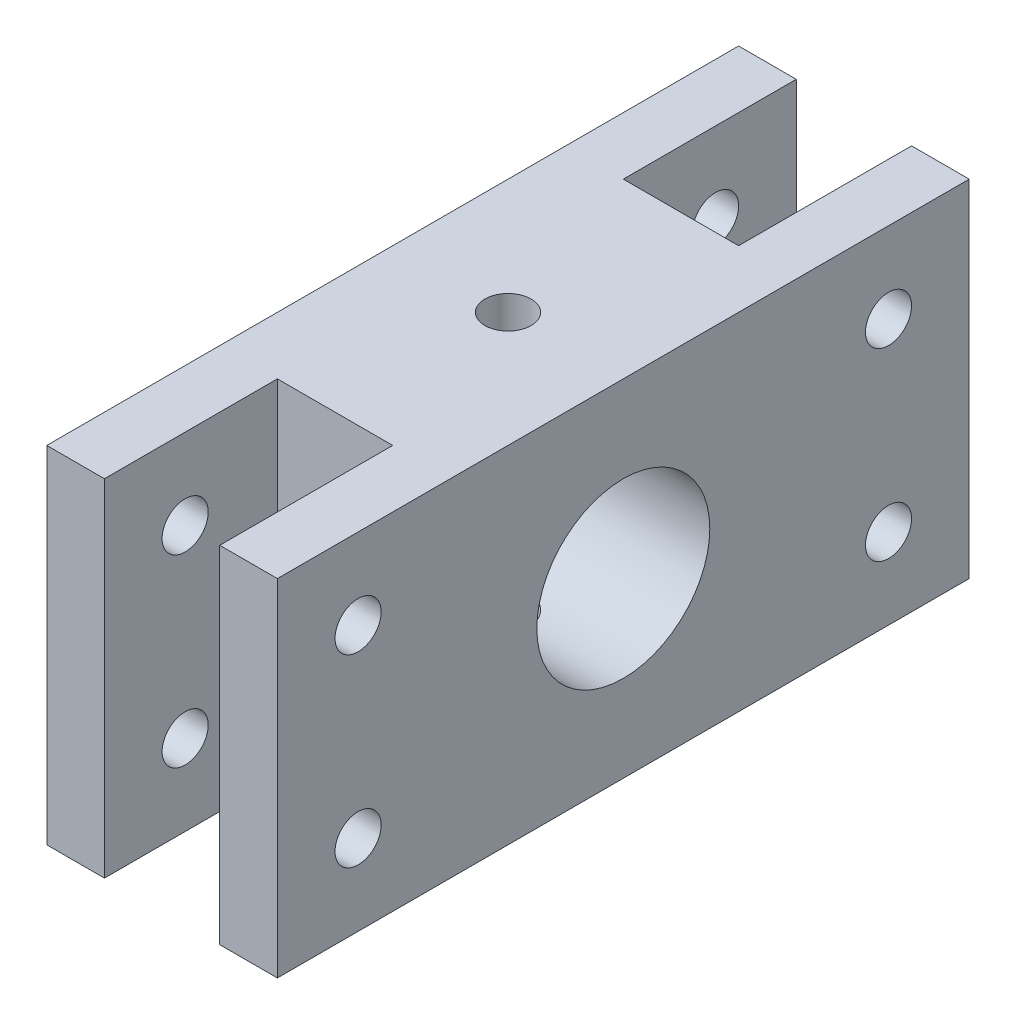
ISO-10303-21;
HEADER;
FILE_DESCRIPTION(('STEP AP214'),'2;1');
FILE_NAME('part.step','',(''),(''),'','','');
FILE_SCHEMA(('AUTOMOTIVE_DESIGN { 1 0 10303 214 1 1 1 1 }'));
ENDSEC;
DATA;
#1=APPLICATION_CONTEXT('core data for automotive mechanical design processes');
#2=APPLICATION_PROTOCOL_DEFINITION('international standard','automotive_design',2000,#1);
#3=PRODUCT_CONTEXT('',#1,'mechanical');
#4=PRODUCT('Part','Part','',(#3));
#5=PRODUCT_RELATED_PRODUCT_CATEGORY('part','',(#4));
#6=PRODUCT_DEFINITION_FORMATION('','',#4);
#7=PRODUCT_DEFINITION_CONTEXT('part definition',#1,'design');
#8=PRODUCT_DEFINITION('design','',#6,#7);
#9=PRODUCT_DEFINITION_SHAPE('','',#8);
#10=(LENGTH_UNIT() NAMED_UNIT(*) SI_UNIT(.MILLI.,.METRE.));
#11=(NAMED_UNIT(*) PLANE_ANGLE_UNIT() SI_UNIT($,.RADIAN.));
#12=(NAMED_UNIT(*) SI_UNIT($,.STERADIAN.) SOLID_ANGLE_UNIT());
#13=UNCERTAINTY_MEASURE_WITH_UNIT(LENGTH_MEASURE(1.E-05),#10,'distance_accuracy_value','');
#14=(GEOMETRIC_REPRESENTATION_CONTEXT(3) GLOBAL_UNCERTAINTY_ASSIGNED_CONTEXT((#13)) GLOBAL_UNIT_ASSIGNED_CONTEXT((#10,
#11,#12)) REPRESENTATION_CONTEXT('',''));
#15=CARTESIAN_POINT('',(0.,0.,0.));
#16=DIRECTION('',(0.,0.,1.));
#17=DIRECTION('',(1.,0.,0.));
#18=AXIS2_PLACEMENT_3D('',#15,#16,#17);
#19=CARTESIAN_POINT('',(20.,15.,-30.));
#20=DIRECTION('',(0.,0.,1.));
#21=DIRECTION('',(0.,-1.,0.));
#22=AXIS2_PLACEMENT_3D('',#19,#20,#21);
#23=PLANE('',#22);
#24=DIRECTION('',(-1.,0.,0.));
#25=VECTOR('',#24,1.);
#26=CARTESIAN_POINT('',(20.,-15.,-30.));
#27=LINE('',#26,#25);
#28=CARTESIAN_POINT('',(20.,-15.,-30.));
#29=VERTEX_POINT('',#28);
#30=CARTESIAN_POINT('',(15.,-15.,-30.));
#31=VERTEX_POINT('',#30);
#32=EDGE_CURVE('E160',#29,#31,#27,.T.);
#33=ORIENTED_EDGE('',*,*,#32,.T.);
#34=DIRECTION('',(0.,1.,0.));
#35=VECTOR('',#34,1.);
#36=CARTESIAN_POINT('',(15.,-15.,-30.));
#37=LINE('',#36,#35);
#38=CARTESIAN_POINT('',(15.,15.,-30.));
#39=VERTEX_POINT('',#38);
#40=EDGE_CURVE('E186',#31,#39,#37,.T.);
#41=ORIENTED_EDGE('',*,*,#40,.T.);
#42=DIRECTION('',(-1.,0.,0.));
#43=VECTOR('',#42,1.);
#44=CARTESIAN_POINT('',(20.,15.,-30.));
#45=LINE('',#44,#43);
#46=CARTESIAN_POINT('',(20.,15.,-30.));
#47=VERTEX_POINT('',#46);
#48=EDGE_CURVE('E11',#47,#39,#45,.T.);
#49=ORIENTED_EDGE('',*,*,#48,.F.);
#50=DIRECTION('',(0.,1.,0.));
#51=VECTOR('',#50,1.);
#52=CARTESIAN_POINT('',(20.,15.,-30.));
#53=LINE('',#52,#51);
#54=EDGE_CURVE('E352',#29,#47,#53,.T.);
#55=ORIENTED_EDGE('',*,*,#54,.F.);
#56=EDGE_LOOP('',(#33,#41,#49,#55));
#57=FACE_BOUND('',#56,.T.);
#58=ADVANCED_FACE('F39',(#57),#23,.F.);
#59=CARTESIAN_POINT('',(20.,15.,30.));
#60=DIRECTION('',(0.,0.,-1.));
#61=DIRECTION('',(0.,1.,0.));
#62=AXIS2_PLACEMENT_3D('',#59,#60,#61);
#63=PLANE('',#62);
#64=DIRECTION('',(-1.,0.,0.));
#65=VECTOR('',#64,1.);
#66=CARTESIAN_POINT('',(20.,-15.,30.));
#67=LINE('',#66,#65);
#68=CARTESIAN_POINT('',(4.99999999999999,-15.,30.));
#69=VERTEX_POINT('',#68);
#70=CARTESIAN_POINT('',(0.,-15.,30.));
#71=VERTEX_POINT('',#70);
#72=EDGE_CURVE('E166',#69,#71,#67,.T.);
#73=ORIENTED_EDGE('',*,*,#72,.F.);
#74=DIRECTION('',(0.,1.,0.));
#75=VECTOR('',#74,1.);
#76=CARTESIAN_POINT('',(4.99999999999999,-15.,30.));
#77=LINE('',#76,#75);
#78=CARTESIAN_POINT('',(4.99999999999999,15.,30.));
#79=VERTEX_POINT('',#78);
#80=EDGE_CURVE('E294',#69,#79,#77,.T.);
#81=ORIENTED_EDGE('',*,*,#80,.T.);
#82=DIRECTION('',(-1.,0.,0.));
#83=VECTOR('',#82,1.);
#84=CARTESIAN_POINT('',(20.,15.,30.));
#85=LINE('',#84,#83);
#86=CARTESIAN_POINT('',(0.,15.,30.));
#87=VERTEX_POINT('',#86);
#88=EDGE_CURVE('E176',#79,#87,#85,.T.);
#89=ORIENTED_EDGE('',*,*,#88,.T.);
#90=DIRECTION('',(0.,-1.,0.));
#91=VECTOR('',#90,1.);
#92=CARTESIAN_POINT('',(0.,15.,30.));
#93=LINE('',#92,#91);
#94=EDGE_CURVE('E364',#87,#71,#93,.T.);
#95=ORIENTED_EDGE('',*,*,#94,.T.);
#96=EDGE_LOOP('',(#73,#81,#89,#95));
#97=FACE_BOUND('',#96,.T.);
#98=ADVANCED_FACE('F224',(#97),#63,.F.);
#99=CARTESIAN_POINT('',(20.,8.,23.));
#100=DIRECTION('',(-1.,0.,0.));
#101=DIRECTION('',(0.,0.,1.));
#102=AXIS2_PLACEMENT_3D('',#99,#100,#101);
#103=CYLINDRICAL_SURFACE('',#102,2.);
#104=CARTESIAN_POINT('',(4.99999999999999,8.,23.));
#105=DIRECTION('',(-1.,0.,0.));
#106=DIRECTION('',(0.,0.,1.));
#107=AXIS2_PLACEMENT_3D('',#104,#105,#106);
#108=CIRCLE('',#107,2.);
#109=CARTESIAN_POINT('',(4.99999999999999,8.,25.));
#110=VERTEX_POINT('',#109);
#111=EDGE_CURVE('E200',#110,#110,#108,.T.);
#112=ORIENTED_EDGE('',*,*,#111,.F.);
#113=EDGE_LOOP('',(#112));
#114=FACE_BOUND('',#113,.T.);
#115=CARTESIAN_POINT('',(0.,8.,23.));
#116=DIRECTION('',(1.,0.,0.));
#117=DIRECTION('',(0.,0.,-1.));
#118=AXIS2_PLACEMENT_3D('',#115,#116,#117);
#119=CIRCLE('',#118,2.);
#120=CARTESIAN_POINT('',(0.,8.,21.));
#121=VERTEX_POINT('',#120);
#122=EDGE_CURVE('E340',#121,#121,#119,.T.);
#123=ORIENTED_EDGE('',*,*,#122,.F.);
#124=EDGE_LOOP('',(#123));
#125=FACE_BOUND('',#124,.T.);
#126=ADVANCED_FACE('F229',(#114,#125),#103,.F.);
#127=CARTESIAN_POINT('',(20.,-8.,23.));
#128=DIRECTION('',(-1.,0.,0.));
#129=DIRECTION('',(0.,0.,1.));
#130=AXIS2_PLACEMENT_3D('',#127,#128,#129);
#131=CYLINDRICAL_SURFACE('',#130,2.);
#132=CARTESIAN_POINT('',(4.99999999999999,-8.,23.));
#133=DIRECTION('',(-1.,0.,0.));
#134=DIRECTION('',(0.,0.,1.));
#135=AXIS2_PLACEMENT_3D('',#132,#133,#134);
#136=CIRCLE('',#135,2.);
#137=CARTESIAN_POINT('',(4.99999999999999,-8.,25.));
#138=VERTEX_POINT('',#137);
#139=EDGE_CURVE('E197',#138,#138,#136,.T.);
#140=ORIENTED_EDGE('',*,*,#139,.F.);
#141=EDGE_LOOP('',(#140));
#142=FACE_BOUND('',#141,.T.);
#143=CARTESIAN_POINT('',(0.,-8.,23.));
#144=DIRECTION('',(1.,0.,0.));
#145=DIRECTION('',(0.,0.,1.));
#146=AXIS2_PLACEMENT_3D('',#143,#144,#145);
#147=CIRCLE('',#146,2.);
#148=CARTESIAN_POINT('',(0.,-8.,25.));
#149=VERTEX_POINT('',#148);
#150=EDGE_CURVE('E332',#149,#149,#147,.T.);
#151=ORIENTED_EDGE('',*,*,#150,.F.);
#152=EDGE_LOOP('',(#151));
#153=FACE_BOUND('',#152,.T.);
#154=ADVANCED_FACE('F447',(#142,#153),#131,.F.);
#155=CARTESIAN_POINT('',(20.,-8.,-23.));
#156=DIRECTION('',(-1.,0.,0.));
#157=DIRECTION('',(0.,0.,1.));
#158=AXIS2_PLACEMENT_3D('',#155,#156,#157);
#159=CYLINDRICAL_SURFACE('',#158,2.);
#160=CARTESIAN_POINT('',(15.,-8.,-23.));
#161=DIRECTION('',(1.,0.,0.));
#162=DIRECTION('',(0.,0.,-1.));
#163=AXIS2_PLACEMENT_3D('',#160,#161,#162);
#164=CIRCLE('',#163,2.);
#165=CARTESIAN_POINT('',(15.,-8.,-25.));
#166=VERTEX_POINT('',#165);
#167=EDGE_CURVE('E191',#166,#166,#164,.T.);
#168=ORIENTED_EDGE('',*,*,#167,.F.);
#169=EDGE_LOOP('',(#168));
#170=FACE_BOUND('',#169,.T.);
#171=CARTESIAN_POINT('',(20.,-8.,-23.));
#172=DIRECTION('',(1.,0.,0.));
#173=DIRECTION('',(0.,0.,-1.));
#174=AXIS2_PLACEMENT_3D('',#171,#172,#173);
#175=CIRCLE('',#174,2.);
#176=CARTESIAN_POINT('',(20.,-8.,-25.));
#177=VERTEX_POINT('',#176);
#178=EDGE_CURVE('E328',#177,#177,#175,.T.);
#179=ORIENTED_EDGE('',*,*,#178,.T.);
#180=EDGE_LOOP('',(#179));
#181=FACE_BOUND('',#180,.T.);
#182=ADVANCED_FACE('F440',(#170,#181),#159,.F.);
#183=CARTESIAN_POINT('',(20.,8.,-23.));
#184=DIRECTION('',(-1.,0.,0.));
#185=DIRECTION('',(0.,0.,1.));
#186=AXIS2_PLACEMENT_3D('',#183,#184,#185);
#187=CYLINDRICAL_SURFACE('',#186,2.);
#188=CARTESIAN_POINT('',(15.,8.,-23.));
#189=DIRECTION('',(1.,0.,0.));
#190=DIRECTION('',(0.,0.,-1.));
#191=AXIS2_PLACEMENT_3D('',#188,#189,#190);
#192=CIRCLE('',#191,2.);
#193=CARTESIAN_POINT('',(15.,8.,-25.));
#194=VERTEX_POINT('',#193);
#195=EDGE_CURVE('E187',#194,#194,#192,.T.);
#196=ORIENTED_EDGE('',*,*,#195,.F.);
#197=EDGE_LOOP('',(#196));
#198=FACE_BOUND('',#197,.T.);
#199=CARTESIAN_POINT('',(20.,8.,-23.));
#200=DIRECTION('',(1.,0.,0.));
#201=DIRECTION('',(0.,0.,1.));
#202=AXIS2_PLACEMENT_3D('',#199,#200,#201);
#203=CIRCLE('',#202,2.);
#204=CARTESIAN_POINT('',(20.,8.,-21.));
#205=VERTEX_POINT('',#204);
#206=EDGE_CURVE('E320',#205,#205,#203,.T.);
#207=ORIENTED_EDGE('',*,*,#206,.T.);
#208=EDGE_LOOP('',(#207));
#209=FACE_BOUND('',#208,.T.);
#210=ADVANCED_FACE('F247',(#198,#209),#187,.F.);
#211=CARTESIAN_POINT('',(20.,0.,0.));
#212=DIRECTION('',(1.,0.,0.));
#213=DIRECTION('',(0.,0.,-1.));
#214=AXIS2_PLACEMENT_3D('',#211,#212,#213);
#215=PLANE('',#214);
#216=CARTESIAN_POINT('',(20.,0.,0.));
#217=DIRECTION('',(-1.,0.,0.));
#218=DIRECTION('',(0.,0.,1.));
#219=AXIS2_PLACEMENT_3D('',#216,#217,#218);
#220=CIRCLE('',#219,7.5);
#221=CARTESIAN_POINT('',(20.,0.,7.5));
#222=VERTEX_POINT('',#221);
#223=EDGE_CURVE('E278',#222,#222,#220,.T.);
#224=ORIENTED_EDGE('',*,*,#223,.T.);
#225=EDGE_LOOP('',(#224));
#226=FACE_BOUND('',#225,.T.);
#227=ORIENTED_EDGE('',*,*,#178,.F.);
#228=EDGE_LOOP('',(#227));
#229=FACE_BOUND('',#228,.T.);
#230=CARTESIAN_POINT('',(20.,8.,23.));
#231=DIRECTION('',(1.,0.,0.));
#232=DIRECTION('',(0.,0.,-1.));
#233=AXIS2_PLACEMENT_3D('',#230,#231,#232);
#234=CIRCLE('',#233,2.);
#235=CARTESIAN_POINT('',(20.,8.,21.));
#236=VERTEX_POINT('',#235);
#237=EDGE_CURVE('E344',#236,#236,#234,.T.);
#238=ORIENTED_EDGE('',*,*,#237,.F.);
#239=EDGE_LOOP('',(#238));
#240=FACE_BOUND('',#239,.T.);
#241=ORIENTED_EDGE('',*,*,#54,.T.);
#242=DIRECTION('',(0.,0.,1.));
#243=VECTOR('',#242,1.);
#244=CARTESIAN_POINT('',(20.,15.,30.));
#245=LINE('',#244,#243);
#246=CARTESIAN_POINT('',(20.,15.,30.));
#247=VERTEX_POINT('',#246);
#248=EDGE_CURVE('E268',#47,#247,#245,.T.);
#249=ORIENTED_EDGE('',*,*,#248,.T.);
#250=DIRECTION('',(0.,-1.,0.));
#251=VECTOR('',#250,1.);
#252=CARTESIAN_POINT('',(20.,15.,30.));
#253=LINE('',#252,#251);
#254=CARTESIAN_POINT('',(20.,-15.,30.));
#255=VERTEX_POINT('',#254);
#256=EDGE_CURVE('E167',#247,#255,#253,.T.);
#257=ORIENTED_EDGE('',*,*,#256,.T.);
#258=DIRECTION('',(0.,0.,-1.));
#259=VECTOR('',#258,1.);
#260=CARTESIAN_POINT('',(20.,-15.,30.));
#261=LINE('',#260,#259);
#262=EDGE_CURVE('E161',#255,#29,#261,.T.);
#263=ORIENTED_EDGE('',*,*,#262,.T.);
#264=EDGE_LOOP('',(#241,#249,#257,#263));
#265=FACE_BOUND('',#264,.T.);
#266=CARTESIAN_POINT('',(20.,-8.,23.));
#267=DIRECTION('',(1.,0.,0.));
#268=DIRECTION('',(0.,0.,1.));
#269=AXIS2_PLACEMENT_3D('',#266,#267,#268);
#270=CIRCLE('',#269,2.);
#271=CARTESIAN_POINT('',(20.,-8.,25.));
#272=VERTEX_POINT('',#271);
#273=EDGE_CURVE('E336',#272,#272,#270,.T.);
#274=ORIENTED_EDGE('',*,*,#273,.F.);
#275=EDGE_LOOP('',(#274));
#276=FACE_BOUND('',#275,.T.);
#277=ORIENTED_EDGE('',*,*,#206,.F.);
#278=EDGE_LOOP('',(#277));
#279=FACE_BOUND('',#278,.T.);
#280=ADVANCED_FACE('F241',(#226,#229,#240,#265,#276,#279),#215,.T.);
#281=CARTESIAN_POINT('',(0.,0.,0.));
#282=DIRECTION('',(1.,0.,0.));
#283=DIRECTION('',(0.,0.,-1.));
#284=AXIS2_PLACEMENT_3D('',#281,#282,#283);
#285=PLANE('',#284);
#286=CARTESIAN_POINT('',(0.,0.,0.));
#287=DIRECTION('',(-1.,0.,0.));
#288=DIRECTION('',(0.,0.,1.));
#289=AXIS2_PLACEMENT_3D('',#286,#287,#288);
#290=CIRCLE('',#289,7.5);
#291=CARTESIAN_POINT('',(0.,0.,7.5));
#292=VERTEX_POINT('',#291);
#293=EDGE_CURVE('E285',#292,#292,#290,.T.);
#294=ORIENTED_EDGE('',*,*,#293,.F.);
#295=EDGE_LOOP('',(#294));
#296=FACE_BOUND('',#295,.T.);
#297=DIRECTION('',(0.,1.,0.));
#298=VECTOR('',#297,1.);
#299=CARTESIAN_POINT('',(0.,15.,-30.));
#300=LINE('',#299,#298);
#301=CARTESIAN_POINT('',(0.,-15.,-30.));
#302=VERTEX_POINT('',#301);
#303=CARTESIAN_POINT('',(0.,15.,-30.));
#304=VERTEX_POINT('',#303);
#305=EDGE_CURVE('E348',#302,#304,#300,.T.);
#306=ORIENTED_EDGE('',*,*,#305,.F.);
#307=DIRECTION('',(0.,0.,-1.));
#308=VECTOR('',#307,1.);
#309=CARTESIAN_POINT('',(0.,-15.,30.));
#310=LINE('',#309,#308);
#311=EDGE_CURVE('E157',#71,#302,#310,.T.);
#312=ORIENTED_EDGE('',*,*,#311,.F.);
#313=ORIENTED_EDGE('',*,*,#94,.F.);
#314=DIRECTION('',(0.,0.,1.));
#315=VECTOR('',#314,1.);
#316=CARTESIAN_POINT('',(0.,15.,30.));
#317=LINE('',#316,#315);
#318=EDGE_CURVE('E361',#304,#87,#317,.T.);
#319=ORIENTED_EDGE('',*,*,#318,.F.);
#320=EDGE_LOOP('',(#306,#312,#313,#319));
#321=FACE_BOUND('',#320,.T.);
#322=ORIENTED_EDGE('',*,*,#122,.T.);
#323=EDGE_LOOP('',(#322));
#324=FACE_BOUND('',#323,.T.);
#325=ORIENTED_EDGE('',*,*,#150,.T.);
#326=EDGE_LOOP('',(#325));
#327=FACE_BOUND('',#326,.T.);
#328=CARTESIAN_POINT('',(0.,-8.,-23.));
#329=DIRECTION('',(1.,0.,0.));
#330=DIRECTION('',(0.,0.,-1.));
#331=AXIS2_PLACEMENT_3D('',#328,#329,#330);
#332=CIRCLE('',#331,2.);
#333=CARTESIAN_POINT('',(0.,-8.,-25.));
#334=VERTEX_POINT('',#333);
#335=EDGE_CURVE('E324',#334,#334,#332,.T.);
#336=ORIENTED_EDGE('',*,*,#335,.T.);
#337=EDGE_LOOP('',(#336));
#338=FACE_BOUND('',#337,.T.);
#339=CARTESIAN_POINT('',(0.,8.,-23.));
#340=DIRECTION('',(1.,0.,0.));
#341=DIRECTION('',(0.,0.,1.));
#342=AXIS2_PLACEMENT_3D('',#339,#340,#341);
#343=CIRCLE('',#342,2.);
#344=CARTESIAN_POINT('',(0.,8.,-21.));
#345=VERTEX_POINT('',#344);
#346=EDGE_CURVE('E319',#345,#345,#343,.T.);
#347=ORIENTED_EDGE('',*,*,#346,.T.);
#348=EDGE_LOOP('',(#347));
#349=FACE_BOUND('',#348,.T.);
#350=ADVANCED_FACE('F235',(#296,#321,#324,#327,#338,#349),#285,.F.);
#351=CARTESIAN_POINT('',(5.,15.,-30.));
#352=VERTEX_POINT('',#351);
#353=EDGE_CURVE('E54',#352,#304,#45,.T.);
#354=ORIENTED_EDGE('',*,*,#353,.F.);
#355=DIRECTION('',(0.,1.,0.));
#356=VECTOR('',#355,1.);
#357=CARTESIAN_POINT('',(5.,-15.,-30.));
#358=LINE('',#357,#356);
#359=CARTESIAN_POINT('',(5.,-15.,-30.));
#360=VERTEX_POINT('',#359);
#361=EDGE_CURVE('E139',#360,#352,#358,.T.);
#362=ORIENTED_EDGE('',*,*,#361,.F.);
#363=EDGE_CURVE('E150',#360,#302,#27,.T.);
#364=ORIENTED_EDGE('',*,*,#363,.T.);
#365=ORIENTED_EDGE('',*,*,#305,.T.);
#366=EDGE_LOOP('',(#354,#362,#364,#365));
#367=FACE_BOUND('',#366,.T.);
#368=ADVANCED_FACE('F41',(#367),#23,.F.);
#369=CARTESIAN_POINT('',(20.,15.,30.));
#370=DIRECTION('',(0.,-1.,0.));
#371=DIRECTION('',(0.,0.,-1.));
#372=AXIS2_PLACEMENT_3D('',#369,#370,#371);
#373=PLANE('',#372);
#374=CARTESIAN_POINT('',(10.,15.,0.));
#375=DIRECTION('',(0.,1.,0.));
#376=DIRECTION('',(0.,0.,1.));
#377=AXIS2_PLACEMENT_3D('',#374,#375,#376);
#378=CIRCLE('',#377,2.);
#379=CARTESIAN_POINT('',(10.,15.,2.));
#380=VERTEX_POINT('',#379);
#381=EDGE_CURVE('E410',#380,#380,#378,.T.);
#382=ORIENTED_EDGE('',*,*,#381,.F.);
#383=EDGE_LOOP('',(#382));
#384=FACE_BOUND('',#383,.T.);
#385=ORIENTED_EDGE('',*,*,#48,.T.);
#386=DIRECTION('',(0.,0.,-1.));
#387=VECTOR('',#386,1.);
#388=CARTESIAN_POINT('',(15.,15.,-30.));
#389=LINE('',#388,#387);
#390=CARTESIAN_POINT('',(15.,15.,-15.));
#391=VERTEX_POINT('',#390);
#392=EDGE_CURVE('E145',#391,#39,#389,.T.);
#393=ORIENTED_EDGE('',*,*,#392,.F.);
#394=DIRECTION('',(1.,0.,0.));
#395=VECTOR('',#394,1.);
#396=CARTESIAN_POINT('',(5.,15.,-15.));
#397=LINE('',#396,#395);
#398=CARTESIAN_POINT('',(5.,15.,-15.));
#399=VERTEX_POINT('',#398);
#400=EDGE_CURVE('E396',#399,#391,#397,.T.);
#401=ORIENTED_EDGE('',*,*,#400,.F.);
#402=DIRECTION('',(0.,0.,1.));
#403=VECTOR('',#402,1.);
#404=CARTESIAN_POINT('',(5.,15.,-30.));
#405=LINE('',#404,#403);
#406=EDGE_CURVE('E298',#352,#399,#405,.T.);
#407=ORIENTED_EDGE('',*,*,#406,.F.);
#408=ORIENTED_EDGE('',*,*,#353,.T.);
#409=ORIENTED_EDGE('',*,*,#318,.T.);
#410=ORIENTED_EDGE('',*,*,#88,.F.);
#411=DIRECTION('',(0.,0.,1.));
#412=VECTOR('',#411,1.);
#413=CARTESIAN_POINT('',(4.99999999999999,15.,30.));
#414=LINE('',#413,#412);
#415=CARTESIAN_POINT('',(4.99999999999999,15.,15.));
#416=VERTEX_POINT('',#415);
#417=EDGE_CURVE('E282',#416,#79,#414,.T.);
#418=ORIENTED_EDGE('',*,*,#417,.F.);
#419=DIRECTION('',(-1.,0.,0.));
#420=VECTOR('',#419,1.);
#421=CARTESIAN_POINT('',(4.99999999999999,15.,15.));
#422=LINE('',#421,#420);
#423=CARTESIAN_POINT('',(15.,15.,15.));
#424=VERTEX_POINT('',#423);
#425=EDGE_CURVE('E275',#424,#416,#422,.T.);
#426=ORIENTED_EDGE('',*,*,#425,.F.);
#427=DIRECTION('',(0.,0.,-1.));
#428=VECTOR('',#427,1.);
#429=CARTESIAN_POINT('',(15.,15.,30.));
#430=LINE('',#429,#428);
#431=CARTESIAN_POINT('',(15.,15.,30.));
#432=VERTEX_POINT('',#431);
#433=EDGE_CURVE('E272',#432,#424,#430,.T.);
#434=ORIENTED_EDGE('',*,*,#433,.F.);
#435=EDGE_CURVE('E177',#247,#432,#85,.T.);
#436=ORIENTED_EDGE('',*,*,#435,.F.);
#437=ORIENTED_EDGE('',*,*,#248,.F.);
#438=EDGE_LOOP('',(#385,#393,#401,#407,#408,#409,#410,#418,#426,#434,#436,#437));
#439=FACE_BOUND('',#438,.T.);
#440=ADVANCED_FACE('F234',(#384,#439),#373,.F.);
#441=ORIENTED_EDGE('',*,*,#435,.T.);
#442=DIRECTION('',(0.,1.,0.));
#443=VECTOR('',#442,1.);
#444=CARTESIAN_POINT('',(15.,-15.,30.));
#445=LINE('',#444,#443);
#446=CARTESIAN_POINT('',(15.,-15.,30.));
#447=VERTEX_POINT('',#446);
#448=EDGE_CURVE('E265',#447,#432,#445,.T.);
#449=ORIENTED_EDGE('',*,*,#448,.F.);
#450=EDGE_CURVE('E172',#255,#447,#67,.T.);
#451=ORIENTED_EDGE('',*,*,#450,.F.);
#452=ORIENTED_EDGE('',*,*,#256,.F.);
#453=EDGE_LOOP('',(#441,#449,#451,#452));
#454=FACE_BOUND('',#453,.T.);
#455=ADVANCED_FACE('F232',(#454),#63,.F.);
#456=CARTESIAN_POINT('',(20.,-15.,30.));
#457=DIRECTION('',(0.,1.,0.));
#458=DIRECTION('',(0.,0.,1.));
#459=AXIS2_PLACEMENT_3D('',#456,#457,#458);
#460=PLANE('',#459);
#461=CARTESIAN_POINT('',(10.,-15.,0.));
#462=DIRECTION('',(0.,1.,0.));
#463=DIRECTION('',(0.,0.,1.));
#464=AXIS2_PLACEMENT_3D('',#461,#462,#463);
#465=CIRCLE('',#464,2.);
#466=CARTESIAN_POINT('',(10.,-15.,2.));
#467=VERTEX_POINT('',#466);
#468=EDGE_CURVE('E207',#467,#467,#465,.T.);
#469=ORIENTED_EDGE('',*,*,#468,.T.);
#470=EDGE_LOOP('',(#469));
#471=FACE_BOUND('',#470,.T.);
#472=DIRECTION('',(1.,0.,0.));
#473=VECTOR('',#472,1.);
#474=CARTESIAN_POINT('',(5.,-15.,-15.));
#475=LINE('',#474,#473);
#476=CARTESIAN_POINT('',(5.,-15.,-15.));
#477=VERTEX_POINT('',#476);
#478=CARTESIAN_POINT('',(15.,-15.,-15.));
#479=VERTEX_POINT('',#478);
#480=EDGE_CURVE('E62',#477,#479,#475,.T.);
#481=ORIENTED_EDGE('',*,*,#480,.T.);
#482=DIRECTION('',(0.,0.,-1.));
#483=VECTOR('',#482,1.);
#484=CARTESIAN_POINT('',(15.,-15.,-30.));
#485=LINE('',#484,#483);
#486=EDGE_CURVE('E153',#479,#31,#485,.T.);
#487=ORIENTED_EDGE('',*,*,#486,.T.);
#488=ORIENTED_EDGE('',*,*,#32,.F.);
#489=ORIENTED_EDGE('',*,*,#262,.F.);
#490=ORIENTED_EDGE('',*,*,#450,.T.);
#491=DIRECTION('',(0.,0.,-1.));
#492=VECTOR('',#491,1.);
#493=CARTESIAN_POINT('',(15.,-15.,30.));
#494=LINE('',#493,#492);
#495=CARTESIAN_POINT('',(15.,-15.,15.));
#496=VERTEX_POINT('',#495);
#497=EDGE_CURVE('E293',#447,#496,#494,.T.);
#498=ORIENTED_EDGE('',*,*,#497,.T.);
#499=DIRECTION('',(-1.,0.,0.));
#500=VECTOR('',#499,1.);
#501=CARTESIAN_POINT('',(4.99999999999999,-15.,15.));
#502=LINE('',#501,#500);
#503=CARTESIAN_POINT('',(4.99999999999999,-15.,15.));
#504=VERTEX_POINT('',#503);
#505=EDGE_CURVE('E70',#496,#504,#502,.T.);
#506=ORIENTED_EDGE('',*,*,#505,.T.);
#507=DIRECTION('',(0.,0.,1.));
#508=VECTOR('',#507,1.);
#509=CARTESIAN_POINT('',(4.99999999999999,-15.,30.));
#510=LINE('',#509,#508);
#511=EDGE_CURVE('E288',#504,#69,#510,.T.);
#512=ORIENTED_EDGE('',*,*,#511,.T.);
#513=ORIENTED_EDGE('',*,*,#72,.T.);
#514=ORIENTED_EDGE('',*,*,#311,.T.);
#515=ORIENTED_EDGE('',*,*,#363,.F.);
#516=DIRECTION('',(0.,0.,1.));
#517=VECTOR('',#516,1.);
#518=CARTESIAN_POINT('',(5.,-15.,-30.));
#519=LINE('',#518,#517);
#520=EDGE_CURVE('E135',#360,#477,#519,.T.);
#521=ORIENTED_EDGE('',*,*,#520,.T.);
#522=EDGE_LOOP('',(#481,#487,#488,#489,#490,#498,#506,#512,#513,#514,#515,#521));
#523=FACE_BOUND('',#522,.T.);
#524=ADVANCED_FACE('F155',(#471,#523),#460,.F.);
#525=CARTESIAN_POINT('',(15.,8.,23.));
#526=DIRECTION('',(1.,0.,0.));
#527=DIRECTION('',(0.,0.,-1.));
#528=AXIS2_PLACEMENT_3D('',#525,#526,#527);
#529=CIRCLE('',#528,2.);
#530=CARTESIAN_POINT('',(15.,8.,21.));
#531=VERTEX_POINT('',#530);
#532=EDGE_CURVE('E196',#531,#531,#529,.T.);
#533=ORIENTED_EDGE('',*,*,#532,.F.);
#534=EDGE_LOOP('',(#533));
#535=FACE_BOUND('',#534,.T.);
#536=ORIENTED_EDGE('',*,*,#237,.T.);
#537=EDGE_LOOP('',(#536));
#538=FACE_BOUND('',#537,.T.);
#539=ADVANCED_FACE('F255',(#535,#538),#103,.F.);
#540=CARTESIAN_POINT('',(15.,-8.,23.));
#541=DIRECTION('',(1.,0.,0.));
#542=DIRECTION('',(0.,0.,-1.));
#543=AXIS2_PLACEMENT_3D('',#540,#541,#542);
#544=CIRCLE('',#543,2.);
#545=CARTESIAN_POINT('',(15.,-8.,21.));
#546=VERTEX_POINT('',#545);
#547=EDGE_CURVE('E192',#546,#546,#544,.T.);
#548=ORIENTED_EDGE('',*,*,#547,.F.);
#549=EDGE_LOOP('',(#548));
#550=FACE_BOUND('',#549,.T.);
#551=ORIENTED_EDGE('',*,*,#273,.T.);
#552=EDGE_LOOP('',(#551));
#553=FACE_BOUND('',#552,.T.);
#554=ADVANCED_FACE('F462',(#550,#553),#131,.F.);
#555=CARTESIAN_POINT('',(5.,-8.,-23.));
#556=DIRECTION('',(-1.,0.,0.));
#557=DIRECTION('',(0.,0.,1.));
#558=AXIS2_PLACEMENT_3D('',#555,#556,#557);
#559=CIRCLE('',#558,2.);
#560=CARTESIAN_POINT('',(5.,-8.,-21.));
#561=VERTEX_POINT('',#560);
#562=EDGE_CURVE('E185',#561,#561,#559,.T.);
#563=ORIENTED_EDGE('',*,*,#562,.F.);
#564=EDGE_LOOP('',(#563));
#565=FACE_BOUND('',#564,.T.);
#566=ORIENTED_EDGE('',*,*,#335,.F.);
#567=EDGE_LOOP('',(#566));
#568=FACE_BOUND('',#567,.T.);
#569=ADVANCED_FACE('F450',(#565,#568),#159,.F.);
#570=CARTESIAN_POINT('',(5.,8.,-23.));
#571=DIRECTION('',(-1.,0.,0.));
#572=DIRECTION('',(0.,0.,1.));
#573=AXIS2_PLACEMENT_3D('',#570,#571,#572);
#574=CIRCLE('',#573,2.);
#575=CARTESIAN_POINT('',(5.,8.,-21.));
#576=VERTEX_POINT('',#575);
#577=EDGE_CURVE('E181',#576,#576,#574,.T.);
#578=ORIENTED_EDGE('',*,*,#577,.F.);
#579=EDGE_LOOP('',(#578));
#580=FACE_BOUND('',#579,.T.);
#581=ORIENTED_EDGE('',*,*,#346,.F.);
#582=EDGE_LOOP('',(#581));
#583=FACE_BOUND('',#582,.T.);
#584=ADVANCED_FACE('F443',(#580,#583),#187,.F.);
#585=CARTESIAN_POINT('',(15.,-15.,-30.));
#586=DIRECTION('',(1.,0.,0.));
#587=DIRECTION('',(0.,0.,-1.));
#588=AXIS2_PLACEMENT_3D('',#585,#586,#587);
#589=PLANE('',#588);
#590=ORIENTED_EDGE('',*,*,#167,.T.);
#591=EDGE_LOOP('',(#590));
#592=FACE_BOUND('',#591,.T.);
#593=ORIENTED_EDGE('',*,*,#195,.T.);
#594=EDGE_LOOP('',(#593));
#595=FACE_BOUND('',#594,.T.);
#596=ORIENTED_EDGE('',*,*,#392,.T.);
#597=ORIENTED_EDGE('',*,*,#40,.F.);
#598=ORIENTED_EDGE('',*,*,#486,.F.);
#599=DIRECTION('',(0.,1.,0.));
#600=VECTOR('',#599,1.);
#601=CARTESIAN_POINT('',(15.,-15.,-15.));
#602=LINE('',#601,#600);
#603=EDGE_CURVE('E388',#479,#391,#602,.T.);
#604=ORIENTED_EDGE('',*,*,#603,.T.);
#605=EDGE_LOOP('',(#596,#597,#598,#604));
#606=FACE_BOUND('',#605,.T.);
#607=ADVANCED_FACE('F454',(#592,#595,#606),#589,.F.);
#608=CARTESIAN_POINT('',(5.,-15.,-15.));
#609=DIRECTION('',(0.,0.,1.));
#610=DIRECTION('',(1.,0.,0.));
#611=AXIS2_PLACEMENT_3D('',#608,#609,#610);
#612=PLANE('',#611);
#613=ORIENTED_EDGE('',*,*,#400,.T.);
#614=ORIENTED_EDGE('',*,*,#603,.F.);
#615=ORIENTED_EDGE('',*,*,#480,.F.);
#616=DIRECTION('',(0.,1.,0.));
#617=VECTOR('',#616,1.);
#618=CARTESIAN_POINT('',(5.,-15.,-15.));
#619=LINE('',#618,#617);
#620=EDGE_CURVE('E141',#477,#399,#619,.T.);
#621=ORIENTED_EDGE('',*,*,#620,.T.);
#622=EDGE_LOOP('',(#613,#614,#615,#621));
#623=FACE_BOUND('',#622,.T.);
#624=ADVANCED_FACE('F460',(#623),#612,.F.);
#625=CARTESIAN_POINT('',(5.,-15.,-30.));
#626=DIRECTION('',(-1.,0.,0.));
#627=DIRECTION('',(0.,0.,1.));
#628=AXIS2_PLACEMENT_3D('',#625,#626,#627);
#629=PLANE('',#628);
#630=ORIENTED_EDGE('',*,*,#562,.T.);
#631=EDGE_LOOP('',(#630));
#632=FACE_BOUND('',#631,.T.);
#633=ORIENTED_EDGE('',*,*,#577,.T.);
#634=EDGE_LOOP('',(#633));
#635=FACE_BOUND('',#634,.T.);
#636=ORIENTED_EDGE('',*,*,#406,.T.);
#637=ORIENTED_EDGE('',*,*,#620,.F.);
#638=ORIENTED_EDGE('',*,*,#520,.F.);
#639=ORIENTED_EDGE('',*,*,#361,.T.);
#640=EDGE_LOOP('',(#636,#637,#638,#639));
#641=FACE_BOUND('',#640,.T.);
#642=ADVANCED_FACE('F138',(#632,#635,#641),#629,.F.);
#643=CARTESIAN_POINT('',(4.99999999999999,-15.,30.));
#644=DIRECTION('',(-1.,0.,0.));
#645=DIRECTION('',(0.,0.,1.));
#646=AXIS2_PLACEMENT_3D('',#643,#644,#645);
#647=PLANE('',#646);
#648=ORIENTED_EDGE('',*,*,#111,.T.);
#649=EDGE_LOOP('',(#648));
#650=FACE_BOUND('',#649,.T.);
#651=ORIENTED_EDGE('',*,*,#139,.T.);
#652=EDGE_LOOP('',(#651));
#653=FACE_BOUND('',#652,.T.);
#654=ORIENTED_EDGE('',*,*,#417,.T.);
#655=ORIENTED_EDGE('',*,*,#80,.F.);
#656=ORIENTED_EDGE('',*,*,#511,.F.);
#657=DIRECTION('',(0.,1.,0.));
#658=VECTOR('',#657,1.);
#659=CARTESIAN_POINT('',(4.99999999999999,-15.,15.));
#660=LINE('',#659,#658);
#661=EDGE_CURVE('E299',#504,#416,#660,.T.);
#662=ORIENTED_EDGE('',*,*,#661,.T.);
#663=EDGE_LOOP('',(#654,#655,#656,#662));
#664=FACE_BOUND('',#663,.T.);
#665=ADVANCED_FACE('F470',(#650,#653,#664),#647,.F.);
#666=CARTESIAN_POINT('',(4.99999999999999,-15.,15.));
#667=DIRECTION('',(0.,0.,-1.));
#668=DIRECTION('',(-1.,0.,0.));
#669=AXIS2_PLACEMENT_3D('',#666,#667,#668);
#670=PLANE('',#669);
#671=ORIENTED_EDGE('',*,*,#425,.T.);
#672=ORIENTED_EDGE('',*,*,#661,.F.);
#673=ORIENTED_EDGE('',*,*,#505,.F.);
#674=DIRECTION('',(0.,1.,0.));
#675=VECTOR('',#674,1.);
#676=CARTESIAN_POINT('',(15.,-15.,15.));
#677=LINE('',#676,#675);
#678=EDGE_CURVE('E302',#496,#424,#677,.T.);
#679=ORIENTED_EDGE('',*,*,#678,.T.);
#680=EDGE_LOOP('',(#671,#672,#673,#679));
#681=FACE_BOUND('',#680,.T.);
#682=ADVANCED_FACE('F477',(#681),#670,.F.);
#683=CARTESIAN_POINT('',(15.,-15.,30.));
#684=DIRECTION('',(1.,0.,0.));
#685=DIRECTION('',(0.,0.,-1.));
#686=AXIS2_PLACEMENT_3D('',#683,#684,#685);
#687=PLANE('',#686);
#688=ORIENTED_EDGE('',*,*,#532,.T.);
#689=EDGE_LOOP('',(#688));
#690=FACE_BOUND('',#689,.T.);
#691=ORIENTED_EDGE('',*,*,#547,.T.);
#692=EDGE_LOOP('',(#691));
#693=FACE_BOUND('',#692,.T.);
#694=ORIENTED_EDGE('',*,*,#433,.T.);
#695=ORIENTED_EDGE('',*,*,#678,.F.);
#696=ORIENTED_EDGE('',*,*,#497,.F.);
#697=ORIENTED_EDGE('',*,*,#448,.T.);
#698=EDGE_LOOP('',(#694,#695,#696,#697));
#699=FACE_BOUND('',#698,.T.);
#700=ADVANCED_FACE('F422',(#690,#693,#699),#687,.F.);
#701=CARTESIAN_POINT('',(20.,0.,0.));
#702=DIRECTION('',(-1.,0.,0.));
#703=DIRECTION('',(0.,0.,1.));
#704=AXIS2_PLACEMENT_3D('',#701,#702,#703);
#705=CYLINDRICAL_SURFACE('',#704,7.5);
#706=CARTESIAN_POINT('',(10.,-7.22841614740048,2.));
#707=CARTESIAN_POINT('',(9.88982406225972,-7.22841805697252,1.99999734315871));
#708=CARTESIAN_POINT('',(9.77961999952398,-7.23096264549673,1.99086493224742));
#709=CARTESIAN_POINT('',(9.56239457844363,-7.24083561155097,1.95464583260237));
#710=CARTESIAN_POINT('',(9.45537484502194,-7.24816638907934,1.92755013620952));
#711=CARTESIAN_POINT('',(9.24769193005322,-7.26672375176839,1.85635845560073));
#712=CARTESIAN_POINT('',(9.14702004117157,-7.27794485684204,1.81228637542177));
#713=CARTESIAN_POINT('',(8.95448325994017,-7.30301154920402,1.70846784563703));
#714=CARTESIAN_POINT('',(8.86261905249301,-7.31685734034424,1.64872017841449));
#715=CARTESIAN_POINT('',(8.68800745301228,-7.34600139553467,1.51364847874559));
#716=CARTESIAN_POINT('',(8.60551298253554,-7.36132541116443,1.43800297504208));
#717=CARTESIAN_POINT('',(8.4542184230488,-7.39147701436507,1.27397427284021));
#718=CARTESIAN_POINT('',(8.38541975385821,-7.40630455033439,1.18558975534664));
#719=CARTESIAN_POINT('',(8.26241506159708,-7.43407988468418,0.996838170873268));
#720=CARTESIAN_POINT('',(8.20846048136715,-7.44699376262293,0.896301819879479));
#721=CARTESIAN_POINT('',(8.11831536463275,-7.46919126211834,0.68718304472909));
#722=CARTESIAN_POINT('',(8.08212183271845,-7.47847549576262,0.578601980875103));
#723=CARTESIAN_POINT('',(8.02934477976423,-7.49218553576461,0.359115961810089));
#724=CARTESIAN_POINT('',(8.01233102337409,-7.49671776750265,0.248321224200915));
#725=CARTESIAN_POINT('',(7.99704287989283,-7.50078524617749,0.0253635535085746));
#726=CARTESIAN_POINT('',(7.99876535636986,-7.50032132946608,-0.0867991474385307));
#727=CARTESIAN_POINT('',(8.02059781253947,-7.49452675859765,-0.306314237111348));
#728=CARTESIAN_POINT('',(8.04024295763629,-7.48931914026999,-0.413716600721112));
#729=CARTESIAN_POINT('',(8.09661213778195,-7.4747674859047,-0.623641315571056));
#730=CARTESIAN_POINT('',(8.13333714668605,-7.46542321400589,-0.726163388180581));
#731=CARTESIAN_POINT('',(8.22317984759238,-7.44346569099892,-0.924603945147554));
#732=CARTESIAN_POINT('',(8.2764568071007,-7.43082087877672,-1.02044668632954));
#733=CARTESIAN_POINT('',(8.3977688195091,-7.40362468509504,-1.20198999876452));
#734=CARTESIAN_POINT('',(8.46580674902818,-7.38907293223,-1.28768858808586));
#735=CARTESIAN_POINT('',(8.61717685793391,-7.35911272938719,-1.44928536946561));
#736=CARTESIAN_POINT('',(8.70091444504936,-7.34369169368738,-1.52480192017774));
#737=CARTESIAN_POINT('',(8.88002467623882,-7.31413405023521,-1.6608133210477));
#738=CARTESIAN_POINT('',(8.97539802920045,-7.29999752083065,-1.72130725529808));
#739=CARTESIAN_POINT('',(9.17590010182131,-7.27455902280777,-1.82584679186274));
#740=CARTESIAN_POINT('',(9.28108535091316,-7.26327507092156,-1.86978866600526));
#741=CARTESIAN_POINT('',(9.49772649945497,-7.24504325087515,-1.93924001685674));
#742=CARTESIAN_POINT('',(9.60918083645033,-7.23809430746845,-1.96475406461341));
#743=CARTESIAN_POINT('',(9.83162721102836,-7.22954835612976,-1.99596757092855));
#744=CARTESIAN_POINT('',(9.94253354862131,-7.22779763213457,-2.00223632621177));
#745=CARTESIAN_POINT('',(10.1638097728086,-7.22942578390815,-1.9963498112297));
#746=CARTESIAN_POINT('',(10.27417971524,-7.23280411376438,-1.98419650172323));
#747=CARTESIAN_POINT('',(10.4890565940915,-7.24416124318865,-1.94231271869971));
#748=CARTESIAN_POINT('',(10.5936354379372,-7.25205039699299,-1.91292447912922));
#749=CARTESIAN_POINT('',(10.7963796313599,-7.27145268952784,-1.83778986725474));
#750=CARTESIAN_POINT('',(10.8945441414274,-7.28296630148563,-1.79204135876651));
#751=CARTESIAN_POINT('',(11.0840549574352,-7.30863572472984,-1.68432905508707));
#752=CARTESIAN_POINT('',(11.1752039758897,-7.32284404872864,-1.62203095237924));
#753=CARTESIAN_POINT('',(11.3459633017032,-7.35217841933666,-1.48340227987515));
#754=CARTESIAN_POINT('',(11.4255714349542,-7.36730463810238,-1.40706907222966));
#755=CARTESIAN_POINT('',(11.5733524732499,-7.39729964884456,-1.23990378250484));
#756=CARTESIAN_POINT('',(11.6411283769786,-7.41214836523849,-1.14871641600885));
#757=CARTESIAN_POINT('',(11.7604109874105,-7.43946670017127,-0.955928435940741));
#758=CARTESIAN_POINT('',(11.8119185600789,-7.45193644532905,-0.854328377018883));
#759=CARTESIAN_POINT('',(11.8967296323615,-7.47301150899261,-0.644314134825872));
#760=CARTESIAN_POINT('',(11.9301690194435,-7.48164558480385,-0.535957852882336));
#761=CARTESIAN_POINT('',(11.9782887280644,-7.49420303787247,-0.31489938473132));
#762=CARTESIAN_POINT('',(11.9929732067747,-7.4981274590498,-0.202198167320243));
#763=CARTESIAN_POINT('',(12.0029058237414,-7.50077413437691,0.0206420013461492));
#764=CARTESIAN_POINT('',(11.9987363191312,-7.49965226288082,0.130753511527864));
#765=CARTESIAN_POINT('',(11.9724315064248,-7.4926849097886,0.348648304630718));
#766=CARTESIAN_POINT('',(11.950296872883,-7.48683960554786,0.456431674812814));
#767=CARTESIAN_POINT('',(11.8890193950814,-7.47111310390923,0.665910123464211));
#768=CARTESIAN_POINT('',(11.8499947065276,-7.46125997189229,0.767642011851541));
#769=CARTESIAN_POINT('',(11.7561503982538,-7.43854816516494,0.963172098471355));
#770=CARTESIAN_POINT('',(11.7013285633872,-7.42568906899253,1.05696918166215));
#771=CARTESIAN_POINT('',(11.575741727863,-7.39791331224121,1.23667826867367));
#772=CARTESIAN_POINT('',(11.5045906193013,-7.38295093371635,1.32231336173331));
#773=CARTESIAN_POINT('',(11.3490972506351,-7.35284000077256,1.48062537156133));
#774=CARTESIAN_POINT('',(11.2647515241807,-7.33769139839721,1.55329887243048));
#775=CARTESIAN_POINT('',(11.0830316041824,-7.30853959638856,1.68520700232562));
#776=CARTESIAN_POINT('',(10.9854116863428,-7.29456891224646,1.74411094261233));
#777=CARTESIAN_POINT('',(10.7812936891398,-7.26981393903472,1.84458689030054));
#778=CARTESIAN_POINT('',(10.6748014714605,-7.25902756724947,1.88617023367332));
#779=CARTESIAN_POINT('',(10.4739186639487,-7.24336000653874,1.94538124252481));
#780=CARTESIAN_POINT('',(10.3803987354433,-7.23780140272195,1.96581518399489));
#781=CARTESIAN_POINT('',(10.191259442006,-7.2303288521157,1.9931249429388));
#782=CARTESIAN_POINT('',(10.0956403177112,-7.22841448976017,2.0000023063216));
#783=CARTESIAN_POINT('',(10.,-7.22841614740048,2.));
#784=B_SPLINE_CURVE_WITH_KNOTS('',3,(#706,#707,#708,#709,#710,#711,#712,#713,#714,#715,#716,
#717,#718,#719,#720,#721,#722,#723,#724,#725,#726,#727,#728,#729,#730,#731,#732,#733,#734,#735,
#736,#737,#738,#739,#740,#741,#742,#743,#744,#745,#746,#747,#748,#749,#750,#751,#752,#753,#754,
#755,#756,#757,#758,#759,#760,#761,#762,#763,#764,#765,#766,#767,#768,#769,#770,#771,#772,#773,
#774,#775,#776,#777,#778,#779,#780,#781,#782,#783),.UNSPECIFIED.,.T.,.F.,(4,2,2,2,2,2,2,2,2,2,2,
2,2,2,2,2,2,2,2,2,2,2,2,2,2,2,2,2,2,2,2,2,2,2,2,2,2,2,4),(0.,0.330176128116026,
0.660517947850202,0.990396311596172,1.32030030656105,1.65765916130211,1.99505297124461,
2.33785207370803,2.68059334304246,3.0154830431648,3.35031668385603,3.67670570800803,
4.00311334440695,4.3327644890557,4.66247993394491,5.00231762300329,5.34217602639579,
5.68413015096536,6.02599942418507,6.35765334242023,6.68927196343503,7.01451850432574,
7.33980752864823,7.67224634967772,8.00474771541474,8.34685906959633,8.68895221008103,
9.028435395914,9.36784331959005,9.69684054916463,10.0258254261296,10.3525451486866,
10.6793107076596,11.0147885399158,11.3503546538105,11.6933003898558,12.0360213210131,
12.3226696767153,12.6092853429065),.UNSPECIFIED.);
#785=CARTESIAN_POINT('',(10.,-7.22841614740048,2.));
#786=VERTEX_POINT('',#785);
#787=EDGE_CURVE('E43',#786,#786,#784,.T.);
#788=ORIENTED_EDGE('',*,*,#787,.T.);
#789=EDGE_LOOP('',(#788));
#790=FACE_BOUND('',#789,.T.);
#791=CARTESIAN_POINT('',(10.,7.22841614740048,2.));
#792=CARTESIAN_POINT('',(10.1101759377403,7.22841805697252,1.99999734315871));
#793=CARTESIAN_POINT('',(10.220380000476,7.23096264549673,1.99086493224742));
#794=CARTESIAN_POINT('',(10.4376054215564,7.24083561155097,1.95464583260237));
#795=CARTESIAN_POINT('',(10.5446251549781,7.24816638907934,1.92755013620952));
#796=CARTESIAN_POINT('',(10.7523080699468,7.26672375176839,1.85635845560073));
#797=CARTESIAN_POINT('',(10.8529799588284,7.27794485684204,1.81228637542177));
#798=CARTESIAN_POINT('',(11.0455167400598,7.30301154920402,1.70846784563703));
#799=CARTESIAN_POINT('',(11.137380947507,7.31685734034424,1.64872017841449));
#800=CARTESIAN_POINT('',(11.3119925469877,7.34600139553467,1.51364847874559));
#801=CARTESIAN_POINT('',(11.3944870174645,7.36132541116443,1.43800297504208));
#802=CARTESIAN_POINT('',(11.5457815769512,7.39147701436507,1.27397427284021));
#803=CARTESIAN_POINT('',(11.6145802461418,7.40630455033439,1.18558975534664));
#804=CARTESIAN_POINT('',(11.7375849384029,7.43407988468418,0.996838170873268));
#805=CARTESIAN_POINT('',(11.7915395186329,7.44699376262293,0.896301819879479));
#806=CARTESIAN_POINT('',(11.8816846353673,7.46919126211834,0.68718304472909));
#807=CARTESIAN_POINT('',(11.9178781672816,7.47847549576262,0.578601980875103));
#808=CARTESIAN_POINT('',(11.9706552202358,7.49218553576461,0.359115961810089));
#809=CARTESIAN_POINT('',(11.9876689766259,7.49671776750265,0.248321224200915));
#810=CARTESIAN_POINT('',(12.0029571201072,7.50078524617749,0.0253635535085746));
#811=CARTESIAN_POINT('',(12.0012346436301,7.50032132946608,-0.0867991474385307));
#812=CARTESIAN_POINT('',(11.9794021874605,7.49452675859765,-0.306314237111347));
#813=CARTESIAN_POINT('',(11.9597570423637,7.48931914026999,-0.413716600721111));
#814=CARTESIAN_POINT('',(11.9033878622181,7.4747674859047,-0.623641315571056));
#815=CARTESIAN_POINT('',(11.866662853314,7.46542321400589,-0.726163388180581));
#816=CARTESIAN_POINT('',(11.7768201524076,7.44346569099892,-0.924603945147554));
#817=CARTESIAN_POINT('',(11.7235431928993,7.43082087877672,-1.02044668632954));
#818=CARTESIAN_POINT('',(11.6022311804909,7.40362468509504,-1.20198999876452));
#819=CARTESIAN_POINT('',(11.5341932509718,7.38907293223,-1.28768858808586));
#820=CARTESIAN_POINT('',(11.3828231420661,7.35911272938719,-1.44928536946561));
#821=CARTESIAN_POINT('',(11.2990855549506,7.34369169368738,-1.52480192017774));
#822=CARTESIAN_POINT('',(11.1199753237612,7.31413405023521,-1.6608133210477));
#823=CARTESIAN_POINT('',(11.0246019707996,7.29999752083065,-1.72130725529808));
#824=CARTESIAN_POINT('',(10.8240998981787,7.27455902280777,-1.82584679186274));
#825=CARTESIAN_POINT('',(10.7189146490868,7.26327507092156,-1.86978866600526));
#826=CARTESIAN_POINT('',(10.502273500545,7.24504325087515,-1.93924001685674));
#827=CARTESIAN_POINT('',(10.3908191635497,7.23809430746845,-1.96475406461341));
#828=CARTESIAN_POINT('',(10.1683727889716,7.22954835612976,-1.99596757092855));
#829=CARTESIAN_POINT('',(10.0574664513787,7.22779763213457,-2.00223632621177));
#830=CARTESIAN_POINT('',(9.83619022719145,7.22942578390815,-1.9963498112297));
#831=CARTESIAN_POINT('',(9.72582028476005,7.23280411376438,-1.98419650172323));
#832=CARTESIAN_POINT('',(9.51094340590846,7.24416124318865,-1.94231271869971));
#833=CARTESIAN_POINT('',(9.40636456206277,7.25205039699299,-1.91292447912922));
#834=CARTESIAN_POINT('',(9.20362036864007,7.27145268952784,-1.83778986725474));
#835=CARTESIAN_POINT('',(9.10545585857258,7.28296630148563,-1.79204135876651));
#836=CARTESIAN_POINT('',(8.91594504256479,7.30863572472984,-1.68432905508707));
#837=CARTESIAN_POINT('',(8.82479602411027,7.32284404872864,-1.62203095237924));
#838=CARTESIAN_POINT('',(8.65403669829684,7.35217841933666,-1.48340227987515));
#839=CARTESIAN_POINT('',(8.57442856504585,7.36730463810238,-1.40706907222966));
#840=CARTESIAN_POINT('',(8.42664752675008,7.39729964884456,-1.23990378250484));
#841=CARTESIAN_POINT('',(8.35887162302142,7.41214836523849,-1.14871641600885));
#842=CARTESIAN_POINT('',(8.23958901258949,7.43946670017127,-0.955928435940741));
#843=CARTESIAN_POINT('',(8.18808143992108,7.45193644532905,-0.854328377018883));
#844=CARTESIAN_POINT('',(8.10327036763849,7.47301150899261,-0.644314134825872));
#845=CARTESIAN_POINT('',(8.06983098055653,7.48164558480385,-0.535957852882336));
#846=CARTESIAN_POINT('',(8.02171127193564,7.49420303787247,-0.31489938473132));
#847=CARTESIAN_POINT('',(8.00702679322532,7.4981274590498,-0.202198167320243));
#848=CARTESIAN_POINT('',(7.99709417625856,7.50077413437691,0.0206420013461492));
#849=CARTESIAN_POINT('',(8.00126368086883,7.49965226288082,0.130753511527864));
#850=CARTESIAN_POINT('',(8.02756849357521,7.4926849097886,0.348648304630718));
#851=CARTESIAN_POINT('',(8.04970312711705,7.48683960554786,0.456431674812814));
#852=CARTESIAN_POINT('',(8.1109806049186,7.47111310390923,0.665910123464211));
#853=CARTESIAN_POINT('',(8.15000529347244,7.46125997189229,0.767642011851541));
#854=CARTESIAN_POINT('',(8.24384960174624,7.43854816516494,0.963172098471355));
#855=CARTESIAN_POINT('',(8.29867143661282,7.42568906899253,1.05696918166215));
#856=CARTESIAN_POINT('',(8.42425827213703,7.39791331224121,1.23667826867367));
#857=CARTESIAN_POINT('',(8.49540938069866,7.38295093371635,1.32231336173331));
#858=CARTESIAN_POINT('',(8.65090274936491,7.35284000077256,1.48062537156133));
#859=CARTESIAN_POINT('',(8.73524847581935,7.33769139839721,1.55329887243048));
#860=CARTESIAN_POINT('',(8.9169683958176,7.30853959638856,1.68520700232562));
#861=CARTESIAN_POINT('',(9.01458831365721,7.29456891224646,1.74411094261233));
#862=CARTESIAN_POINT('',(9.21870631086024,7.26981393903472,1.84458689030054));
#863=CARTESIAN_POINT('',(9.32519852853949,7.25902756724947,1.88617023367332));
#864=CARTESIAN_POINT('',(9.52608133605126,7.24336000653874,1.94538124252481));
#865=CARTESIAN_POINT('',(9.61960126455672,7.23780140272195,1.96581518399489));
#866=CARTESIAN_POINT('',(9.80874055799397,7.2303288521157,1.9931249429388));
#867=CARTESIAN_POINT('',(9.90435968228881,7.22841448976017,2.0000023063216));
#868=CARTESIAN_POINT('',(10.,7.22841614740048,2.));
#869=B_SPLINE_CURVE_WITH_KNOTS('',3,(#791,#792,#793,#794,#795,#796,#797,#798,#799,#800,#801,
#802,#803,#804,#805,#806,#807,#808,#809,#810,#811,#812,#813,#814,#815,#816,#817,#818,#819,#820,
#821,#822,#823,#824,#825,#826,#827,#828,#829,#830,#831,#832,#833,#834,#835,#836,#837,#838,#839,
#840,#841,#842,#843,#844,#845,#846,#847,#848,#849,#850,#851,#852,#853,#854,#855,#856,#857,#858,
#859,#860,#861,#862,#863,#864,#865,#866,#867,#868),.UNSPECIFIED.,.T.,.F.,(4,2,2,2,2,2,2,2,2,2,2,
2,2,2,2,2,2,2,2,2,2,2,2,2,2,2,2,2,2,2,2,2,2,2,2,2,2,2,4),(0.,0.330176128116026,
0.660517947850202,0.990396311596168,1.32030030656105,1.65765916130211,1.99505297124461,
2.33785207370803,2.68059334304246,3.0154830431648,3.35031668385603,3.67670570800803,
4.00311334440695,4.3327644890557,4.66247993394491,5.00231762300329,5.34217602639579,
5.68413015096536,6.02599942418507,6.35765334242023,6.68927196343503,7.01451850432574,
7.33980752864823,7.67224634967772,8.00474771541474,8.34685906959633,8.68895221008103,
9.028435395914,9.36784331959005,9.69684054916463,10.0258254261296,10.3525451486866,
10.6793107076596,11.0147885399158,11.3503546538105,11.6933003898558,12.0360213210131,
12.3226696767153,12.6092853429065),.UNSPECIFIED.);
#870=CARTESIAN_POINT('',(10.,7.22841614740048,2.));
#871=VERTEX_POINT('',#870);
#872=EDGE_CURVE('E201',#871,#871,#869,.T.);
#873=ORIENTED_EDGE('',*,*,#872,.T.);
#874=EDGE_LOOP('',(#873));
#875=FACE_BOUND('',#874,.T.);
#876=ORIENTED_EDGE('',*,*,#223,.F.);
#877=EDGE_LOOP('',(#876));
#878=FACE_BOUND('',#877,.T.);
#879=ORIENTED_EDGE('',*,*,#293,.T.);
#880=EDGE_LOOP('',(#879));
#881=FACE_BOUND('',#880,.T.);
#882=ADVANCED_FACE('F208',(#790,#875,#878,#881),#705,.F.);
#883=CARTESIAN_POINT('',(10.,-15.,0.));
#884=DIRECTION('',(0.,1.,0.));
#885=DIRECTION('',(0.,0.,1.));
#886=AXIS2_PLACEMENT_3D('',#883,#884,#885);
#887=CYLINDRICAL_SURFACE('',#886,2.);
#888=ORIENTED_EDGE('',*,*,#381,.T.);
#889=EDGE_LOOP('',(#888));
#890=FACE_BOUND('',#889,.T.);
#891=ORIENTED_EDGE('',*,*,#872,.F.);
#892=EDGE_LOOP('',(#891));
#893=FACE_BOUND('',#892,.T.);
#894=ADVANCED_FACE('F214',(#890,#893),#887,.F.);
#895=ORIENTED_EDGE('',*,*,#468,.F.);
#896=EDGE_LOOP('',(#895));
#897=FACE_BOUND('',#896,.T.);
#898=ORIENTED_EDGE('',*,*,#787,.F.);
#899=EDGE_LOOP('',(#898));
#900=FACE_BOUND('',#899,.T.);
#901=ADVANCED_FACE('F211',(#897,#900),#887,.F.);
#902=CLOSED_SHELL('',(#58,#98,#126,#154,#182,#210,#280,#350,#368,#440,#455,#524,#539,#554,#569,
#584,#607,#624,#642,#665,#682,#700,#882,#894,#901));
#903=MANIFOLD_SOLID_BREP('B2',#902);
#904=ADVANCED_BREP_SHAPE_REPRESENTATION('',(#18,#903),#14);
#905=SHAPE_DEFINITION_REPRESENTATION(#9,#904);
ENDSEC;
END-ISO-10303-21;
